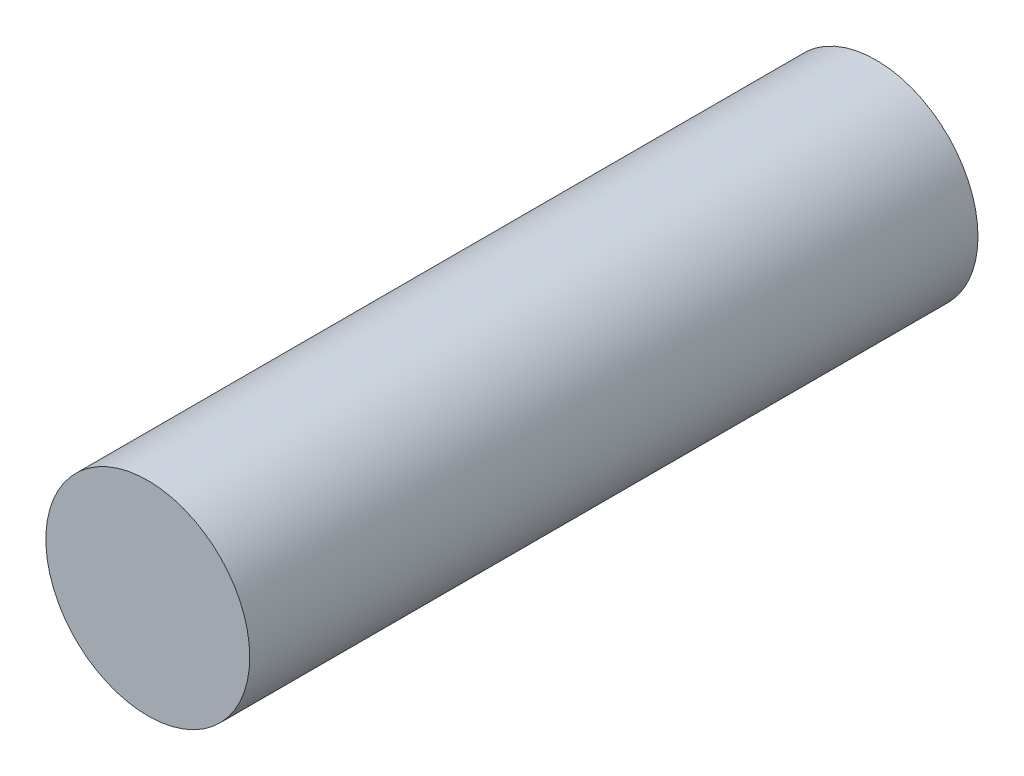
ISO-10303-21;
HEADER;
FILE_DESCRIPTION(('STEP AP214'),'2;1');
FILE_NAME('part.step','',(''),(''),'','','');
FILE_SCHEMA(('AUTOMOTIVE_DESIGN { 1 0 10303 214 1 1 1 1 }'));
ENDSEC;
DATA;
#1=APPLICATION_CONTEXT('core data for automotive mechanical design processes');
#2=APPLICATION_PROTOCOL_DEFINITION('international standard','automotive_design',2000,#1);
#3=PRODUCT_CONTEXT('',#1,'mechanical');
#4=PRODUCT('Part','Part','',(#3));
#5=PRODUCT_RELATED_PRODUCT_CATEGORY('part','',(#4));
#6=PRODUCT_DEFINITION_FORMATION('','',#4);
#7=PRODUCT_DEFINITION_CONTEXT('part definition',#1,'design');
#8=PRODUCT_DEFINITION('design','',#6,#7);
#9=PRODUCT_DEFINITION_SHAPE('','',#8);
#10=(LENGTH_UNIT() NAMED_UNIT(*) SI_UNIT(.MILLI.,.METRE.));
#11=(NAMED_UNIT(*) PLANE_ANGLE_UNIT() SI_UNIT($,.RADIAN.));
#12=(NAMED_UNIT(*) SI_UNIT($,.STERADIAN.) SOLID_ANGLE_UNIT());
#13=UNCERTAINTY_MEASURE_WITH_UNIT(LENGTH_MEASURE(1.E-05),#10,'distance_accuracy_value','');
#14=(GEOMETRIC_REPRESENTATION_CONTEXT(3) GLOBAL_UNCERTAINTY_ASSIGNED_CONTEXT((#13)) GLOBAL_UNIT_ASSIGNED_CONTEXT((#10,
#11,#12)) REPRESENTATION_CONTEXT('',''));
#15=CARTESIAN_POINT('',(0.,0.,0.));
#16=DIRECTION('',(0.,0.,1.));
#17=DIRECTION('',(1.,0.,0.));
#18=AXIS2_PLACEMENT_3D('',#15,#16,#17);
#19=CARTESIAN_POINT('',(0.,0.,100.));
#20=DIRECTION('',(0.,0.,-1.));
#21=DIRECTION('',(-1.,0.,0.));
#22=AXIS2_PLACEMENT_3D('',#19,#20,#21);
#23=CYLINDRICAL_SURFACE('',#22,14.);
#24=CARTESIAN_POINT('',(0.,0.,100.));
#25=DIRECTION('',(0.,0.,1.));
#26=DIRECTION('',(1.,0.,0.));
#27=AXIS2_PLACEMENT_3D('',#24,#25,#26);
#28=CIRCLE('',#27,14.);
#29=CARTESIAN_POINT('',(14.,0.,100.));
#30=VERTEX_POINT('',#29);
#31=EDGE_CURVE('E10',#30,#30,#28,.T.);
#32=ORIENTED_EDGE('',*,*,#31,.F.);
#33=EDGE_LOOP('',(#32));
#34=FACE_BOUND('',#33,.T.);
#35=CARTESIAN_POINT('',(0.,0.,0.));
#36=DIRECTION('',(0.,0.,1.));
#37=DIRECTION('',(1.,0.,0.));
#38=AXIS2_PLACEMENT_3D('',#35,#36,#37);
#39=CIRCLE('',#38,14.);
#40=CARTESIAN_POINT('',(14.,0.,0.));
#41=VERTEX_POINT('',#40);
#42=EDGE_CURVE('E45',#41,#41,#39,.T.);
#43=ORIENTED_EDGE('',*,*,#42,.T.);
#44=EDGE_LOOP('',(#43));
#45=FACE_BOUND('',#44,.T.);
#46=ADVANCED_FACE('F39',(#34,#45),#23,.T.);
#47=CARTESIAN_POINT('',(0.,0.,100.));
#48=DIRECTION('',(0.,0.,1.));
#49=DIRECTION('',(1.,0.,0.));
#50=AXIS2_PLACEMENT_3D('',#47,#48,#49);
#51=PLANE('',#50);
#52=ORIENTED_EDGE('',*,*,#31,.T.);
#53=EDGE_LOOP('',(#52));
#54=FACE_BOUND('',#53,.T.);
#55=ADVANCED_FACE('F53',(#54),#51,.T.);
#56=CARTESIAN_POINT('',(0.,0.,0.));
#57=DIRECTION('',(0.,0.,1.));
#58=DIRECTION('',(1.,0.,0.));
#59=AXIS2_PLACEMENT_3D('',#56,#57,#58);
#60=PLANE('',#59);
#61=ORIENTED_EDGE('',*,*,#42,.F.);
#62=EDGE_LOOP('',(#61));
#63=FACE_BOUND('',#62,.T.);
#64=ADVANCED_FACE('F55',(#63),#60,.F.);
#65=CLOSED_SHELL('',(#46,#55,#64));
#66=MANIFOLD_SOLID_BREP('B2',#65);
#67=ADVANCED_BREP_SHAPE_REPRESENTATION('',(#18,#66),#14);
#68=SHAPE_DEFINITION_REPRESENTATION(#9,#67);
ENDSEC;
END-ISO-10303-21;
